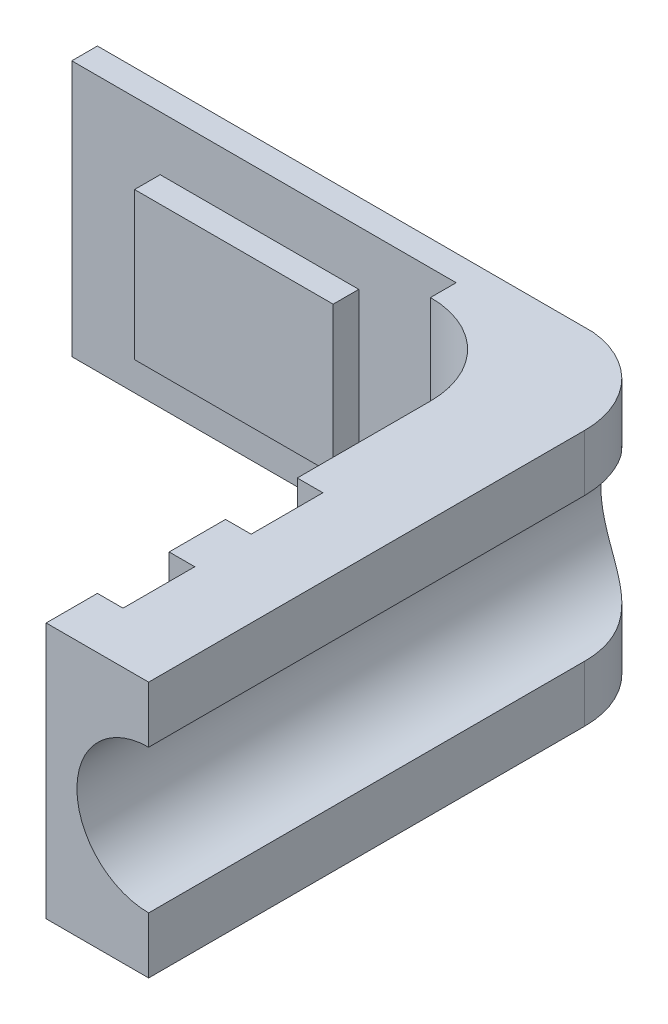
ISO-10303-21;
HEADER;
FILE_DESCRIPTION(('STEP AP214'),'2;1');
FILE_NAME('part.step','',(''),(''),'','','');
FILE_SCHEMA(('AUTOMOTIVE_DESIGN { 1 0 10303 214 1 1 1 1 }'));
ENDSEC;
DATA;
#1=APPLICATION_CONTEXT('core data for automotive mechanical design processes');
#2=APPLICATION_PROTOCOL_DEFINITION('international standard','automotive_design',2000,#1);
#3=PRODUCT_CONTEXT('',#1,'mechanical');
#4=PRODUCT('Part','Part','',(#3));
#5=PRODUCT_RELATED_PRODUCT_CATEGORY('part','',(#4));
#6=PRODUCT_DEFINITION_FORMATION('','',#4);
#7=PRODUCT_DEFINITION_CONTEXT('part definition',#1,'design');
#8=PRODUCT_DEFINITION('design','',#6,#7);
#9=PRODUCT_DEFINITION_SHAPE('','',#8);
#10=(LENGTH_UNIT() NAMED_UNIT(*) SI_UNIT(.MILLI.,.METRE.));
#11=(NAMED_UNIT(*) PLANE_ANGLE_UNIT() SI_UNIT($,.RADIAN.));
#12=(NAMED_UNIT(*) SI_UNIT($,.STERADIAN.) SOLID_ANGLE_UNIT());
#13=UNCERTAINTY_MEASURE_WITH_UNIT(LENGTH_MEASURE(1.E-05),#10,'distance_accuracy_value','');
#14=(GEOMETRIC_REPRESENTATION_CONTEXT(3) GLOBAL_UNCERTAINTY_ASSIGNED_CONTEXT((#13)) GLOBAL_UNIT_ASSIGNED_CONTEXT((#10,
#11,#12)) REPRESENTATION_CONTEXT('',''));
#15=CARTESIAN_POINT('',(0.,0.,0.));
#16=DIRECTION('',(0.,0.,1.));
#17=DIRECTION('',(1.,0.,0.));
#18=AXIS2_PLACEMENT_3D('',#15,#16,#17);
#19=CARTESIAN_POINT('',(3.5,10.,0.));
#20=DIRECTION('',(1.,0.,0.));
#21=DIRECTION('',(0.,0.,-1.));
#22=AXIS2_PLACEMENT_3D('',#19,#20,#21);
#23=PLANE('',#22);
#24=DIRECTION('',(0.,-1.,0.));
#25=VECTOR('',#24,1.);
#26=CARTESIAN_POINT('',(3.5,1.,5.2));
#27=LINE('',#26,#25);
#28=CARTESIAN_POINT('',(3.5,1.,5.2));
#29=VERTEX_POINT('',#28);
#30=CARTESIAN_POINT('',(3.5,0.,5.2));
#31=VERTEX_POINT('',#30);
#32=EDGE_CURVE('E239',#29,#31,#27,.T.);
#33=ORIENTED_EDGE('',*,*,#32,.F.);
#34=DIRECTION('',(0.,0.,1.));
#35=VECTOR('',#34,1.);
#36=CARTESIAN_POINT('',(3.5,1.,5.2));
#37=LINE('',#36,#35);
#38=CARTESIAN_POINT('',(3.5,1.,8.));
#39=VERTEX_POINT('',#38);
#40=EDGE_CURVE('E225',#29,#39,#37,.T.);
#41=ORIENTED_EDGE('',*,*,#40,.T.);
#42=DIRECTION('',(0.,-1.,0.));
#43=VECTOR('',#42,1.);
#44=CARTESIAN_POINT('',(3.5,1.,8.));
#45=LINE('',#44,#43);
#46=CARTESIAN_POINT('',(3.5,0.,8.));
#47=VERTEX_POINT('',#46);
#48=EDGE_CURVE('E256',#39,#47,#45,.T.);
#49=ORIENTED_EDGE('',*,*,#48,.T.);
#50=DIRECTION('',(0.,0.,1.));
#51=VECTOR('',#50,1.);
#52=CARTESIAN_POINT('',(3.5,0.,0.));
#53=LINE('',#52,#51);
#54=CARTESIAN_POINT('',(3.5,0.,10.2));
#55=VERTEX_POINT('',#54);
#56=EDGE_CURVE('E460',#47,#55,#53,.T.);
#57=ORIENTED_EDGE('',*,*,#56,.T.);
#58=DIRECTION('',(0.,-1.,0.));
#59=VECTOR('',#58,1.);
#60=CARTESIAN_POINT('',(3.5,1.,10.2));
#61=LINE('',#60,#59);
#62=CARTESIAN_POINT('',(3.5,1.,10.2));
#63=VERTEX_POINT('',#62);
#64=EDGE_CURVE('E295',#63,#55,#61,.T.);
#65=ORIENTED_EDGE('',*,*,#64,.F.);
#66=DIRECTION('',(0.,0.,1.));
#67=VECTOR('',#66,1.);
#68=CARTESIAN_POINT('',(3.5,1.,10.2));
#69=LINE('',#68,#67);
#70=CARTESIAN_POINT('',(3.5,1.,13.));
#71=VERTEX_POINT('',#70);
#72=EDGE_CURVE('E304',#63,#71,#69,.T.);
#73=ORIENTED_EDGE('',*,*,#72,.T.);
#74=DIRECTION('',(0.,-1.,0.));
#75=VECTOR('',#74,1.);
#76=CARTESIAN_POINT('',(3.5,1.,13.));
#77=LINE('',#76,#75);
#78=CARTESIAN_POINT('',(3.5,0.,13.));
#79=VERTEX_POINT('',#78);
#80=EDGE_CURVE('E309',#71,#79,#77,.T.);
#81=ORIENTED_EDGE('',*,*,#80,.T.);
#82=CARTESIAN_POINT('',(3.5,0.,15.));
#83=VERTEX_POINT('',#82);
#84=EDGE_CURVE('E456',#79,#83,#53,.T.);
#85=ORIENTED_EDGE('',*,*,#84,.T.);
#86=DIRECTION('',(0.,-1.,0.));
#87=VECTOR('',#86,1.);
#88=CARTESIAN_POINT('',(3.5,10.,15.));
#89=LINE('',#88,#87);
#90=CARTESIAN_POINT('',(3.5,10.,15.));
#91=VERTEX_POINT('',#90);
#92=EDGE_CURVE('E483',#91,#83,#89,.T.);
#93=ORIENTED_EDGE('',*,*,#92,.F.);
#94=DIRECTION('',(0.,0.,1.));
#95=VECTOR('',#94,1.);
#96=CARTESIAN_POINT('',(3.5,10.,0.));
#97=LINE('',#96,#95);
#98=CARTESIAN_POINT('',(3.5,10.,13.));
#99=VERTEX_POINT('',#98);
#100=EDGE_CURVE('E425',#99,#91,#97,.T.);
#101=ORIENTED_EDGE('',*,*,#100,.F.);
#102=DIRECTION('',(0.,-1.,0.));
#103=VECTOR('',#102,1.);
#104=CARTESIAN_POINT('',(3.5,9.,13.));
#105=LINE('',#104,#103);
#106=CARTESIAN_POINT('',(3.5,9.,13.));
#107=VERTEX_POINT('',#106);
#108=EDGE_CURVE('E341',#99,#107,#105,.T.);
#109=ORIENTED_EDGE('',*,*,#108,.T.);
#110=DIRECTION('',(0.,0.,1.));
#111=VECTOR('',#110,1.);
#112=CARTESIAN_POINT('',(3.5,9.,10.2));
#113=LINE('',#112,#111);
#114=CARTESIAN_POINT('',(3.5,9.,10.2));
#115=VERTEX_POINT('',#114);
#116=EDGE_CURVE('E337',#115,#107,#113,.T.);
#117=ORIENTED_EDGE('',*,*,#116,.F.);
#118=DIRECTION('',(0.,-1.,0.));
#119=VECTOR('',#118,1.);
#120=CARTESIAN_POINT('',(3.5,9.,10.2));
#121=LINE('',#120,#119);
#122=CARTESIAN_POINT('',(3.5,10.,10.2));
#123=VERTEX_POINT('',#122);
#124=EDGE_CURVE('E329',#123,#115,#121,.T.);
#125=ORIENTED_EDGE('',*,*,#124,.F.);
#126=CARTESIAN_POINT('',(3.5,10.,8.));
#127=VERTEX_POINT('',#126);
#128=EDGE_CURVE('E431',#127,#123,#97,.T.);
#129=ORIENTED_EDGE('',*,*,#128,.F.);
#130=DIRECTION('',(0.,-1.,0.));
#131=VECTOR('',#130,1.);
#132=CARTESIAN_POINT('',(3.5,9.,8.));
#133=LINE('',#132,#131);
#134=CARTESIAN_POINT('',(3.5,9.,8.));
#135=VERTEX_POINT('',#134);
#136=EDGE_CURVE('E61',#127,#135,#133,.T.);
#137=ORIENTED_EDGE('',*,*,#136,.T.);
#138=DIRECTION('',(0.,0.,1.));
#139=VECTOR('',#138,1.);
#140=CARTESIAN_POINT('',(3.5,9.,5.2));
#141=LINE('',#140,#139);
#142=CARTESIAN_POINT('',(3.5,9.,5.2));
#143=VERTEX_POINT('',#142);
#144=EDGE_CURVE('E277',#143,#135,#141,.T.);
#145=ORIENTED_EDGE('',*,*,#144,.F.);
#146=DIRECTION('',(0.,-1.,0.));
#147=VECTOR('',#146,1.);
#148=CARTESIAN_POINT('',(3.5,9.,5.2));
#149=LINE('',#148,#147);
#150=CARTESIAN_POINT('',(3.5,10.,5.2));
#151=VERTEX_POINT('',#150);
#152=EDGE_CURVE('E269',#151,#143,#149,.T.);
#153=ORIENTED_EDGE('',*,*,#152,.F.);
#154=CARTESIAN_POINT('',(3.5,10.,0.));
#155=VERTEX_POINT('',#154);
#156=EDGE_CURVE('E426',#155,#151,#97,.T.);
#157=ORIENTED_EDGE('',*,*,#156,.F.);
#158=DIRECTION('',(0.,-1.,0.));
#159=VECTOR('',#158,1.);
#160=CARTESIAN_POINT('',(3.5,10.,0.));
#161=LINE('',#160,#159);
#162=CARTESIAN_POINT('',(3.5,0.,0.));
#163=VERTEX_POINT('',#162);
#164=EDGE_CURVE('E487',#155,#163,#161,.T.);
#165=ORIENTED_EDGE('',*,*,#164,.T.);
#166=EDGE_CURVE('E248',#163,#31,#53,.T.);
#167=ORIENTED_EDGE('',*,*,#166,.T.);
#168=EDGE_LOOP('',(#33,#41,#49,#57,#65,#73,#81,#85,#93,#101,#109,#117,#125,#129,#137,#145,#153,
#157,#165,#167));
#169=FACE_BOUND('',#168,.T.);
#170=ADVANCED_FACE('F39',(#169),#23,.F.);
#171=CARTESIAN_POINT('',(4.,10.,-2.01719528206896));
#172=DIRECTION('',(0.,1.,0.));
#173=DIRECTION('',(0.,0.,1.));
#174=AXIS2_PLACEMENT_3D('',#171,#172,#173);
#175=PLANE('',#174);
#176=ORIENTED_EDGE('',*,*,#156,.T.);
#177=DIRECTION('',(-1.,0.,0.));
#178=VECTOR('',#177,1.);
#179=CARTESIAN_POINT('',(3.5,10.,5.2));
#180=LINE('',#179,#178);
#181=CARTESIAN_POINT('',(4.5,10.,5.2));
#182=VERTEX_POINT('',#181);
#183=EDGE_CURVE('E266',#182,#151,#180,.T.);
#184=ORIENTED_EDGE('',*,*,#183,.F.);
#185=DIRECTION('',(0.,0.,1.));
#186=VECTOR('',#185,1.);
#187=CARTESIAN_POINT('',(4.5,10.,5.2));
#188=LINE('',#187,#186);
#189=CARTESIAN_POINT('',(4.5,10.,8.));
#190=VERTEX_POINT('',#189);
#191=EDGE_CURVE('E257',#182,#190,#188,.T.);
#192=ORIENTED_EDGE('',*,*,#191,.T.);
#193=DIRECTION('',(-1.,0.,0.));
#194=VECTOR('',#193,1.);
#195=CARTESIAN_POINT('',(3.5,10.,8.));
#196=LINE('',#195,#194);
#197=EDGE_CURVE('E278',#190,#127,#196,.T.);
#198=ORIENTED_EDGE('',*,*,#197,.T.);
#199=ORIENTED_EDGE('',*,*,#128,.T.);
#200=DIRECTION('',(-1.,0.,0.));
#201=VECTOR('',#200,1.);
#202=CARTESIAN_POINT('',(3.5,10.,10.2));
#203=LINE('',#202,#201);
#204=CARTESIAN_POINT('',(4.5,10.,10.2));
#205=VERTEX_POINT('',#204);
#206=EDGE_CURVE('E325',#205,#123,#203,.T.);
#207=ORIENTED_EDGE('',*,*,#206,.F.);
#208=DIRECTION('',(0.,0.,1.));
#209=VECTOR('',#208,1.);
#210=CARTESIAN_POINT('',(4.5,10.,10.2));
#211=LINE('',#210,#209);
#212=CARTESIAN_POINT('',(4.5,10.,13.));
#213=VERTEX_POINT('',#212);
#214=EDGE_CURVE('E310',#205,#213,#211,.T.);
#215=ORIENTED_EDGE('',*,*,#214,.T.);
#216=DIRECTION('',(-1.,0.,0.));
#217=VECTOR('',#216,1.);
#218=CARTESIAN_POINT('',(3.5,10.,13.));
#219=LINE('',#218,#217);
#220=EDGE_CURVE('E264',#213,#99,#219,.T.);
#221=ORIENTED_EDGE('',*,*,#220,.T.);
#222=ORIENTED_EDGE('',*,*,#100,.T.);
#223=DIRECTION('',(1.,0.,0.));
#224=VECTOR('',#223,1.);
#225=CARTESIAN_POINT('',(3.5,10.,15.));
#226=LINE('',#225,#224);
#227=CARTESIAN_POINT('',(7.5,10.,15.));
#228=VERTEX_POINT('',#227);
#229=EDGE_CURVE('E430',#91,#228,#226,.T.);
#230=ORIENTED_EDGE('',*,*,#229,.T.);
#231=DIRECTION('',(0.,0.,-1.));
#232=VECTOR('',#231,1.);
#233=CARTESIAN_POINT('',(7.5,10.,-2.01719528206896));
#234=LINE('',#233,#232);
#235=CARTESIAN_POINT('',(7.5,10.,-2.01719528206896));
#236=VERTEX_POINT('',#235);
#237=EDGE_CURVE('E434',#228,#236,#234,.T.);
#238=ORIENTED_EDGE('',*,*,#237,.T.);
#239=CARTESIAN_POINT('',(4.,10.,-2.01719528206896));
#240=DIRECTION('',(0.,1.,0.));
#241=DIRECTION('',(0.,0.,1.));
#242=AXIS2_PLACEMENT_3D('',#239,#240,#241);
#243=CIRCLE('',#242,3.5);
#244=CARTESIAN_POINT('',(4.34651305423787,10.,-5.5));
#245=VERTEX_POINT('',#244);
#246=EDGE_CURVE('E437',#236,#245,#243,.T.);
#247=ORIENTED_EDGE('',*,*,#246,.T.);
#248=DIRECTION('',(-1.,0.,0.));
#249=VECTOR('',#248,1.);
#250=CARTESIAN_POINT('',(-15.,10.,-5.5));
#251=LINE('',#250,#249);
#252=CARTESIAN_POINT('',(-15.,10.,-5.5));
#253=VERTEX_POINT('',#252);
#254=EDGE_CURVE('E408',#245,#253,#251,.T.);
#255=ORIENTED_EDGE('',*,*,#254,.T.);
#256=DIRECTION('',(0.,0.,1.));
#257=VECTOR('',#256,1.);
#258=CARTESIAN_POINT('',(-15.,10.,-4.5));
#259=LINE('',#258,#257);
#260=CARTESIAN_POINT('',(-15.,10.,-4.5));
#261=VERTEX_POINT('',#260);
#262=EDGE_CURVE('E412',#253,#261,#259,.T.);
#263=ORIENTED_EDGE('',*,*,#262,.T.);
#264=DIRECTION('',(1.,0.,0.));
#265=VECTOR('',#264,1.);
#266=CARTESIAN_POINT('',(-15.,10.,-4.5));
#267=LINE('',#266,#265);
#268=CARTESIAN_POINT('',(0.,10.,-4.5));
#269=VERTEX_POINT('',#268);
#270=EDGE_CURVE('E416',#261,#269,#267,.T.);
#271=ORIENTED_EDGE('',*,*,#270,.T.);
#272=DIRECTION('',(0.,0.,1.));
#273=VECTOR('',#272,1.);
#274=CARTESIAN_POINT('',(0.,10.,-4.5));
#275=LINE('',#274,#273);
#276=CARTESIAN_POINT('',(0.,10.,-3.5));
#277=VERTEX_POINT('',#276);
#278=EDGE_CURVE('E419',#269,#277,#275,.T.);
#279=ORIENTED_EDGE('',*,*,#278,.T.);
#280=CARTESIAN_POINT('',(0.,10.,0.));
#281=DIRECTION('',(0.,-1.,0.));
#282=DIRECTION('',(0.,0.,-1.));
#283=AXIS2_PLACEMENT_3D('',#280,#281,#282);
#284=CIRCLE('',#283,3.5);
#285=EDGE_CURVE('E422',#277,#155,#284,.T.);
#286=ORIENTED_EDGE('',*,*,#285,.T.);
#287=EDGE_LOOP('',(#176,#184,#192,#198,#199,#207,#215,#221,#222,#230,#238,#247,#255,#263,#271,
#279,#286));
#288=FACE_BOUND('',#287,.T.);
#289=ADVANCED_FACE('F529',(#288),#175,.T.);
#290=CARTESIAN_POINT('',(4.,0.,-2.01719528206896));
#291=DIRECTION('',(0.,1.,0.));
#292=DIRECTION('',(0.,0.,1.));
#293=AXIS2_PLACEMENT_3D('',#290,#291,#292);
#294=PLANE('',#293);
#295=DIRECTION('',(1.,0.,0.));
#296=VECTOR('',#295,1.);
#297=CARTESIAN_POINT('',(3.5,0.,5.2));
#298=LINE('',#297,#296);
#299=CARTESIAN_POINT('',(4.5,0.,5.2));
#300=VERTEX_POINT('',#299);
#301=EDGE_CURVE('E235',#31,#300,#298,.T.);
#302=ORIENTED_EDGE('',*,*,#301,.F.);
#303=ORIENTED_EDGE('',*,*,#166,.F.);
#304=CARTESIAN_POINT('',(0.,0.,0.));
#305=DIRECTION('',(0.,-1.,0.));
#306=DIRECTION('',(0.,0.,-1.));
#307=AXIS2_PLACEMENT_3D('',#304,#305,#306);
#308=CIRCLE('',#307,3.5);
#309=CARTESIAN_POINT('',(0.,0.,-3.5));
#310=VERTEX_POINT('',#309);
#311=EDGE_CURVE('E453',#310,#163,#308,.T.);
#312=ORIENTED_EDGE('',*,*,#311,.F.);
#313=DIRECTION('',(0.,0.,1.));
#314=VECTOR('',#313,1.);
#315=CARTESIAN_POINT('',(0.,0.,-4.5));
#316=LINE('',#315,#314);
#317=CARTESIAN_POINT('',(0.,0.,-4.5));
#318=VERTEX_POINT('',#317);
#319=EDGE_CURVE('E450',#318,#310,#316,.T.);
#320=ORIENTED_EDGE('',*,*,#319,.F.);
#321=DIRECTION('',(1.,0.,0.));
#322=VECTOR('',#321,1.);
#323=CARTESIAN_POINT('',(-15.,0.,-4.5));
#324=LINE('',#323,#322);
#325=CARTESIAN_POINT('',(-15.,0.,-4.5));
#326=VERTEX_POINT('',#325);
#327=EDGE_CURVE('E447',#326,#318,#324,.T.);
#328=ORIENTED_EDGE('',*,*,#327,.F.);
#329=DIRECTION('',(0.,0.,1.));
#330=VECTOR('',#329,1.);
#331=CARTESIAN_POINT('',(-15.,0.,-4.5));
#332=LINE('',#331,#330);
#333=CARTESIAN_POINT('',(-15.,0.,-5.5));
#334=VERTEX_POINT('',#333);
#335=EDGE_CURVE('E444',#334,#326,#332,.T.);
#336=ORIENTED_EDGE('',*,*,#335,.F.);
#337=DIRECTION('',(-1.,0.,0.));
#338=VECTOR('',#337,1.);
#339=CARTESIAN_POINT('',(-15.,0.,-5.5));
#340=LINE('',#339,#338);
#341=CARTESIAN_POINT('',(4.34651305423787,0.,-5.5));
#342=VERTEX_POINT('',#341);
#343=EDGE_CURVE('E407',#342,#334,#340,.T.);
#344=ORIENTED_EDGE('',*,*,#343,.F.);
#345=CARTESIAN_POINT('',(4.,0.,-2.01719528206896));
#346=DIRECTION('',(0.,1.,0.));
#347=DIRECTION('',(0.,0.,1.));
#348=AXIS2_PLACEMENT_3D('',#345,#346,#347);
#349=CIRCLE('',#348,3.5);
#350=CARTESIAN_POINT('',(7.5,0.,-2.01719528206896));
#351=VERTEX_POINT('',#350);
#352=EDGE_CURVE('E413',#351,#342,#349,.T.);
#353=ORIENTED_EDGE('',*,*,#352,.F.);
#354=DIRECTION('',(0.,0.,-1.));
#355=VECTOR('',#354,1.);
#356=CARTESIAN_POINT('',(7.5,0.,-2.01719528206896));
#357=LINE('',#356,#355);
#358=CARTESIAN_POINT('',(7.5,0.,15.));
#359=VERTEX_POINT('',#358);
#360=EDGE_CURVE('E464',#359,#351,#357,.T.);
#361=ORIENTED_EDGE('',*,*,#360,.F.);
#362=DIRECTION('',(1.,0.,0.));
#363=VECTOR('',#362,1.);
#364=CARTESIAN_POINT('',(3.5,0.,15.));
#365=LINE('',#364,#363);
#366=EDGE_CURVE('E459',#83,#359,#365,.T.);
#367=ORIENTED_EDGE('',*,*,#366,.F.);
#368=ORIENTED_EDGE('',*,*,#84,.F.);
#369=DIRECTION('',(1.,0.,0.));
#370=VECTOR('',#369,1.);
#371=CARTESIAN_POINT('',(3.5,0.,13.));
#372=LINE('',#371,#370);
#373=CARTESIAN_POINT('',(4.5,0.,13.));
#374=VERTEX_POINT('',#373);
#375=EDGE_CURVE('E296',#79,#374,#372,.T.);
#376=ORIENTED_EDGE('',*,*,#375,.T.);
#377=DIRECTION('',(0.,0.,1.));
#378=VECTOR('',#377,1.);
#379=CARTESIAN_POINT('',(4.5,0.,10.2));
#380=LINE('',#379,#378);
#381=CARTESIAN_POINT('',(4.5,0.,10.2));
#382=VERTEX_POINT('',#381);
#383=EDGE_CURVE('E317',#382,#374,#380,.T.);
#384=ORIENTED_EDGE('',*,*,#383,.F.);
#385=DIRECTION('',(1.,0.,0.));
#386=VECTOR('',#385,1.);
#387=CARTESIAN_POINT('',(3.5,0.,10.2));
#388=LINE('',#387,#386);
#389=EDGE_CURVE('E300',#55,#382,#388,.T.);
#390=ORIENTED_EDGE('',*,*,#389,.F.);
#391=ORIENTED_EDGE('',*,*,#56,.F.);
#392=DIRECTION('',(1.,0.,0.));
#393=VECTOR('',#392,1.);
#394=CARTESIAN_POINT('',(3.5,0.,8.));
#395=LINE('',#394,#393);
#396=CARTESIAN_POINT('',(4.5,0.,8.));
#397=VERTEX_POINT('',#396);
#398=EDGE_CURVE('E243',#47,#397,#395,.T.);
#399=ORIENTED_EDGE('',*,*,#398,.T.);
#400=DIRECTION('',(0.,0.,1.));
#401=VECTOR('',#400,1.);
#402=CARTESIAN_POINT('',(4.5,0.,5.2));
#403=LINE('',#402,#401);
#404=EDGE_CURVE('E234',#300,#397,#403,.T.);
#405=ORIENTED_EDGE('',*,*,#404,.F.);
#406=EDGE_LOOP('',(#302,#303,#312,#320,#328,#336,#344,#353,#361,#367,#368,#376,#384,#390,#391,
#399,#405));
#407=FACE_BOUND('',#406,.T.);
#408=ADVANCED_FACE('F513',(#407),#294,.F.);
#409=CARTESIAN_POINT('',(7.5,10.,-2.01719528206896));
#410=DIRECTION('',(-1.,0.,0.));
#411=DIRECTION('',(0.,0.,1.));
#412=AXIS2_PLACEMENT_3D('',#409,#410,#411);
#413=PLANE('',#412);
#414=DIRECTION('',(0.,-1.,0.));
#415=VECTOR('',#414,1.);
#416=CARTESIAN_POINT('',(7.5,10.,-2.01719528206896));
#417=LINE('',#416,#415);
#418=CARTESIAN_POINT('',(7.5,2.2,-2.01719528206896));
#419=VERTEX_POINT('',#418);
#420=EDGE_CURVE('E473',#419,#351,#417,.T.);
#421=ORIENTED_EDGE('',*,*,#420,.F.);
#422=DIRECTION('',(0.,0.,1.));
#423=VECTOR('',#422,1.);
#424=CARTESIAN_POINT('',(7.5,2.2,-5.5));
#425=LINE('',#424,#423);
#426=CARTESIAN_POINT('',(7.5,2.2,15.));
#427=VERTEX_POINT('',#426);
#428=EDGE_CURVE('E355',#419,#427,#425,.T.);
#429=ORIENTED_EDGE('',*,*,#428,.T.);
#430=DIRECTION('',(0.,-1.,0.));
#431=VECTOR('',#430,1.);
#432=CARTESIAN_POINT('',(7.5,10.,15.));
#433=LINE('',#432,#431);
#434=EDGE_CURVE('E478',#427,#359,#433,.T.);
#435=ORIENTED_EDGE('',*,*,#434,.T.);
#436=ORIENTED_EDGE('',*,*,#360,.T.);
#437=EDGE_LOOP('',(#421,#429,#435,#436));
#438=FACE_BOUND('',#437,.T.);
#439=ADVANCED_FACE('F539',(#438),#413,.F.);
#440=CARTESIAN_POINT('',(-15.,10.,-4.5));
#441=DIRECTION('',(0.,0.,-1.));
#442=DIRECTION('',(-1.,0.,0.));
#443=AXIS2_PLACEMENT_3D('',#440,#441,#442);
#444=PLANE('',#443);
#445=ORIENTED_EDGE('',*,*,#327,.T.);
#446=DIRECTION('',(0.,-1.,0.));
#447=VECTOR('',#446,1.);
#448=CARTESIAN_POINT('',(0.,10.,-4.5));
#449=LINE('',#448,#447);
#450=EDGE_CURVE('E494',#269,#318,#449,.T.);
#451=ORIENTED_EDGE('',*,*,#450,.F.);
#452=ORIENTED_EDGE('',*,*,#270,.F.);
#453=DIRECTION('',(0.,-1.,0.));
#454=VECTOR('',#453,1.);
#455=CARTESIAN_POINT('',(-15.,10.,-4.5));
#456=LINE('',#455,#454);
#457=EDGE_CURVE('E498',#261,#326,#456,.T.);
#458=ORIENTED_EDGE('',*,*,#457,.T.);
#459=EDGE_LOOP('',(#445,#451,#452,#458));
#460=FACE_BOUND('',#459,.T.);
#461=DIRECTION('',(0.,1.,0.));
#462=VECTOR('',#461,1.);
#463=CARTESIAN_POINT('',(-3.8,7.875,-4.5));
#464=LINE('',#463,#462);
#465=CARTESIAN_POINT('',(-3.8,2.12500000000001,-4.5));
#466=VERTEX_POINT('',#465);
#467=CARTESIAN_POINT('',(-3.8,7.87500000000001,-4.5));
#468=VERTEX_POINT('',#467);
#469=EDGE_CURVE('E359',#466,#468,#464,.T.);
#470=ORIENTED_EDGE('',*,*,#469,.F.);
#471=DIRECTION('',(1.,0.,0.));
#472=VECTOR('',#471,1.);
#473=CARTESIAN_POINT('',(-11.55,2.12500000000001,-4.5));
#474=LINE('',#473,#472);
#475=CARTESIAN_POINT('',(-11.55,2.12500000000001,-4.5));
#476=VERTEX_POINT('',#475);
#477=EDGE_CURVE('E368',#476,#466,#474,.T.);
#478=ORIENTED_EDGE('',*,*,#477,.F.);
#479=DIRECTION('',(0.,-1.,0.));
#480=VECTOR('',#479,1.);
#481=CARTESIAN_POINT('',(-11.55,7.87500000000001,-4.5));
#482=LINE('',#481,#480);
#483=CARTESIAN_POINT('',(-11.55,7.87500000000001,-4.5));
#484=VERTEX_POINT('',#483);
#485=EDGE_CURVE('E385',#484,#476,#482,.T.);
#486=ORIENTED_EDGE('',*,*,#485,.F.);
#487=DIRECTION('',(-1.,0.,0.));
#488=VECTOR('',#487,1.);
#489=CARTESIAN_POINT('',(-11.55,7.87500000000001,-4.5));
#490=LINE('',#489,#488);
#491=EDGE_CURVE('E381',#468,#484,#490,.T.);
#492=ORIENTED_EDGE('',*,*,#491,.F.);
#493=EDGE_LOOP('',(#470,#478,#486,#492));
#494=FACE_BOUND('',#493,.T.);
#495=ADVANCED_FACE('F520',(#460,#494),#444,.F.);
#496=CARTESIAN_POINT('',(-15.,10.,-5.5));
#497=DIRECTION('',(0.,0.,1.));
#498=DIRECTION('',(1.,0.,0.));
#499=AXIS2_PLACEMENT_3D('',#496,#497,#498);
#500=PLANE('',#499);
#501=ORIENTED_EDGE('',*,*,#343,.T.);
#502=DIRECTION('',(0.,-1.,0.));
#503=VECTOR('',#502,1.);
#504=CARTESIAN_POINT('',(-15.,10.,-5.5));
#505=LINE('',#504,#503);
#506=EDGE_CURVE('E54',#253,#334,#505,.T.);
#507=ORIENTED_EDGE('',*,*,#506,.F.);
#508=ORIENTED_EDGE('',*,*,#254,.F.);
#509=DIRECTION('',(0.,-1.,0.));
#510=VECTOR('',#509,1.);
#511=CARTESIAN_POINT('',(4.34651305423787,10.,-5.5));
#512=LINE('',#511,#510);
#513=EDGE_CURVE('E440',#245,#342,#512,.T.);
#514=ORIENTED_EDGE('',*,*,#513,.T.);
#515=EDGE_LOOP('',(#501,#507,#508,#514));
#516=FACE_BOUND('',#515,.T.);
#517=ADVANCED_FACE('F41',(#516),#500,.F.);
#518=CARTESIAN_POINT('',(-15.,10.,-4.5));
#519=DIRECTION('',(1.,0.,0.));
#520=DIRECTION('',(0.,0.,-1.));
#521=AXIS2_PLACEMENT_3D('',#518,#519,#520);
#522=PLANE('',#521);
#523=ORIENTED_EDGE('',*,*,#335,.T.);
#524=ORIENTED_EDGE('',*,*,#457,.F.);
#525=ORIENTED_EDGE('',*,*,#262,.F.);
#526=ORIENTED_EDGE('',*,*,#506,.T.);
#527=EDGE_LOOP('',(#523,#524,#525,#526));
#528=FACE_BOUND('',#527,.T.);
#529=ADVANCED_FACE('F505',(#528),#522,.F.);
#530=CARTESIAN_POINT('',(0.,10.,-4.5));
#531=DIRECTION('',(1.,0.,0.));
#532=DIRECTION('',(0.,0.,-1.));
#533=AXIS2_PLACEMENT_3D('',#530,#531,#532);
#534=PLANE('',#533);
#535=ORIENTED_EDGE('',*,*,#319,.T.);
#536=DIRECTION('',(0.,-1.,0.));
#537=VECTOR('',#536,1.);
#538=CARTESIAN_POINT('',(0.,10.,-3.5));
#539=LINE('',#538,#537);
#540=EDGE_CURVE('E490',#277,#310,#539,.T.);
#541=ORIENTED_EDGE('',*,*,#540,.F.);
#542=ORIENTED_EDGE('',*,*,#278,.F.);
#543=ORIENTED_EDGE('',*,*,#450,.T.);
#544=EDGE_LOOP('',(#535,#541,#542,#543));
#545=FACE_BOUND('',#544,.T.);
#546=ADVANCED_FACE('F525',(#545),#534,.F.);
#547=CARTESIAN_POINT('',(0.,10.,0.));
#548=DIRECTION('',(0.,-1.,0.));
#549=DIRECTION('',(0.,0.,-1.));
#550=AXIS2_PLACEMENT_3D('',#547,#548,#549);
#551=CYLINDRICAL_SURFACE('',#550,3.5);
#552=ORIENTED_EDGE('',*,*,#311,.T.);
#553=ORIENTED_EDGE('',*,*,#164,.F.);
#554=ORIENTED_EDGE('',*,*,#285,.F.);
#555=ORIENTED_EDGE('',*,*,#540,.T.);
#556=EDGE_LOOP('',(#552,#553,#554,#555));
#557=FACE_BOUND('',#556,.T.);
#558=ADVANCED_FACE('F583',(#557),#551,.F.);
#559=CARTESIAN_POINT('',(3.5,10.,15.));
#560=DIRECTION('',(0.,0.,-1.));
#561=DIRECTION('',(-1.,0.,0.));
#562=AXIS2_PLACEMENT_3D('',#559,#560,#561);
#563=PLANE('',#562);
#564=ORIENTED_EDGE('',*,*,#434,.F.);
#565=CARTESIAN_POINT('',(7.5,5.,15.));
#566=DIRECTION('',(0.,0.,1.));
#567=DIRECTION('',(1.,0.,0.));
#568=AXIS2_PLACEMENT_3D('',#565,#566,#567);
#569=CIRCLE('',#568,2.8);
#570=CARTESIAN_POINT('',(7.5,7.8,15.));
#571=VERTEX_POINT('',#570);
#572=EDGE_CURVE('E321',#571,#427,#569,.T.);
#573=ORIENTED_EDGE('',*,*,#572,.F.);
#574=EDGE_CURVE('E479',#228,#571,#433,.T.);
#575=ORIENTED_EDGE('',*,*,#574,.F.);
#576=ORIENTED_EDGE('',*,*,#229,.F.);
#577=ORIENTED_EDGE('',*,*,#92,.T.);
#578=ORIENTED_EDGE('',*,*,#366,.T.);
#579=EDGE_LOOP('',(#564,#573,#575,#576,#577,#578));
#580=FACE_BOUND('',#579,.T.);
#581=ADVANCED_FACE('F544',(#580),#563,.F.);
#582=ORIENTED_EDGE('',*,*,#574,.T.);
#583=DIRECTION('',(0.,0.,1.));
#584=VECTOR('',#583,1.);
#585=CARTESIAN_POINT('',(7.5,7.8,-5.5));
#586=LINE('',#585,#584);
#587=CARTESIAN_POINT('',(7.5,7.8,-2.01719528206896));
#588=VERTEX_POINT('',#587);
#589=EDGE_CURVE('E356',#588,#571,#586,.T.);
#590=ORIENTED_EDGE('',*,*,#589,.F.);
#591=EDGE_CURVE('E474',#236,#588,#417,.T.);
#592=ORIENTED_EDGE('',*,*,#591,.F.);
#593=ORIENTED_EDGE('',*,*,#237,.F.);
#594=EDGE_LOOP('',(#582,#590,#592,#593));
#595=FACE_BOUND('',#594,.T.);
#596=ADVANCED_FACE('F608',(#595),#413,.F.);
#597=CARTESIAN_POINT('',(4.,10.,-2.01719528206896));
#598=DIRECTION('',(0.,-1.,0.));
#599=DIRECTION('',(0.,0.,-1.));
#600=AXIS2_PLACEMENT_3D('',#597,#598,#599);
#601=CYLINDRICAL_SURFACE('',#600,3.5);
#602=ORIENTED_EDGE('',*,*,#591,.T.);
#603=CARTESIAN_POINT('',(7.5,7.8,-2.01719528206896));
#604=CARTESIAN_POINT('',(7.50001021676816,7.79996218441873,-2.11480497604137));
#605=CARTESIAN_POINT('',(7.49591713868846,7.7999988133738,-2.21241320863707));
#606=CARTESIAN_POINT('',(7.4795976167923,7.79994765948239,-2.40695076926059));
#607=CARTESIAN_POINT('',(7.46737090291583,7.79985987250483,-2.50388007463808));
#608=CARTESIAN_POINT('',(7.43479167103447,7.79928539408302,-2.69676603554726));
#609=CARTESIAN_POINT('',(7.41440652728685,7.7987970926437,-2.79271718017671));
#610=CARTESIAN_POINT('',(7.36566065545166,7.79688245129346,-2.98256080067346));
#611=CARTESIAN_POINT('',(7.3373001724846,7.79545614021029,-3.07645333971602));
#612=CARTESIAN_POINT('',(7.27275251461261,7.79095067373492,-3.26167408185437));
#613=CARTESIAN_POINT('',(7.2365504587538,7.7878683590503,-3.35299703111772));
#614=CARTESIAN_POINT('',(7.15665154140355,7.77915923119807,-3.53217731745716));
#615=CARTESIAN_POINT('',(7.11295533054667,7.7735326388526,-3.6200349545742));
#616=CARTESIAN_POINT('',(7.01859871275631,7.75871840724365,-3.79134318307697));
#617=CARTESIAN_POINT('',(6.96795552249882,7.74953947237767,-3.87480398456599));
#618=CARTESIAN_POINT('',(6.86021463300209,7.72648233376497,-4.0367547014251));
#619=CARTESIAN_POINT('',(6.80311920286306,7.71260577865527,-4.11524634927151));
#620=CARTESIAN_POINT('',(6.69835085363455,7.68319377801083,-4.24747060262951));
#621=CARTESIAN_POINT('',(6.65191031294592,7.66894911197021,-4.30247240183627));
#622=CARTESIAN_POINT('',(6.5563355169426,7.6366721519278,-4.40890173905396));
#623=CARTESIAN_POINT('',(6.5072018805912,7.61864072557481,-4.46033009225137));
#624=CARTESIAN_POINT('',(6.40681414085268,7.57834598234195,-4.55928328952592));
#625=CARTESIAN_POINT('',(6.35556079080581,7.55608415899192,-4.60680950278781));
#626=CARTESIAN_POINT('',(6.25161369425292,7.50695702770809,-4.69768004202373));
#627=CARTESIAN_POINT('',(6.19892065068855,7.4800939337768,-4.74102636363883));
#628=CARTESIAN_POINT('',(6.09253355102553,7.4213119631748,-4.82359213292625));
#629=CARTESIAN_POINT('',(6.03883547452618,7.38936482272001,-4.8627863387992));
#630=CARTESIAN_POINT('',(5.93161334159882,7.32039309322649,-4.93663121572048));
#631=CARTESIAN_POINT('',(5.87808922250316,7.28337060491439,-4.97128375505298));
#632=CARTESIAN_POINT('',(5.77206394922717,7.20422632741619,-5.03607774687604));
#633=CARTESIAN_POINT('',(5.71956305220581,7.16210327504915,-5.06621807774487));
#634=CARTESIAN_POINT('',(5.61646734934694,7.07290874168197,-5.12210628201149));
#635=CARTESIAN_POINT('',(5.5658724427661,7.02583752272283,-5.14785438781997));
#636=CARTESIAN_POINT('',(5.47168068068105,6.93131445860967,-5.19314329004251));
#637=CARTESIAN_POINT('',(5.4278580030616,6.88425227318981,-5.21302928796481));
#638=CARTESIAN_POINT('',(5.34300562594601,6.78649772671781,-5.24960479605709));
#639=CARTESIAN_POINT('',(5.30197687999546,6.73580413829044,-5.2662932184107));
#640=CARTESIAN_POINT('',(5.18384147110508,6.57876866806782,-5.3119870676567));
#641=CARTESIAN_POINT('',(5.11160920850754,6.46739608017629,-5.336656088858));
#642=CARTESIAN_POINT('',(4.9809313167141,6.23017075545816,-5.37765080329857));
#643=CARTESIAN_POINT('',(4.92307054530043,6.10394280854571,-5.39364687092457));
#644=CARTESIAN_POINT('',(4.82652365117396,5.84368110339236,-5.41856931489625));
#645=CARTESIAN_POINT('',(4.78784324519413,5.70964503121546,-5.42749358395655));
#646=CARTESIAN_POINT('',(4.72873541389777,5.42710192743935,-5.44063657798987));
#647=CARTESIAN_POINT('',(4.70984840141651,5.2782531824297,-5.44446378393821));
#648=CARTESIAN_POINT('',(4.6960810097126,4.97937882140205,-5.44728505409649));
#649=CARTESIAN_POINT('',(4.70120669731411,4.82935291753317,-5.44627789689988));
#650=CARTESIAN_POINT('',(4.73580962796354,4.52781570254283,-5.43902389428205));
#651=CARTESIAN_POINT('',(4.76599368347777,4.37638897113898,-5.43262488341617));
#652=CARTESIAN_POINT('',(4.85070347969179,4.08086978035957,-5.41251382478702));
#653=CARTESIAN_POINT('',(4.90523097678736,3.93677785103077,-5.39880124933122));
#654=CARTESIAN_POINT('',(5.00310791628404,3.73064872136487,-5.3705344473611));
#655=CARTESIAN_POINT('',(5.03814477687087,3.66399567362584,-5.35991957639854));
#656=CARTESIAN_POINT('',(5.11319230721691,3.53413567492586,-5.335683245866));
#657=CARTESIAN_POINT('',(5.15320073896235,3.47092719165409,-5.32206313701432));
#658=CARTESIAN_POINT('',(5.23767954173242,3.34850439826154,-5.29136166373385));
#659=CARTESIAN_POINT('',(5.28214772300651,3.28928815159381,-5.27428199380001));
#660=CARTESIAN_POINT('',(5.37494182587368,3.1753011489274,-5.23620887303749));
#661=CARTESIAN_POINT('',(5.42326743404903,3.12053003248759,-5.21521573999479));
#662=CARTESIAN_POINT('',(5.51972393057567,3.01932700741017,-5.17045936110622));
#663=CARTESIAN_POINT('',(5.56765559075888,2.97258301588489,-5.14697179708374));
#664=CARTESIAN_POINT('',(5.66555527493559,2.88359029634054,-5.09598925464664));
#665=CARTESIAN_POINT('',(5.71552396677392,2.84134305925226,-5.06849295422333));
#666=CARTESIAN_POINT('',(5.81669184848671,2.76155870984943,-5.00936114026367));
#667=CARTESIAN_POINT('',(5.8678901528031,2.72401832213294,-4.97772853676559));
#668=CARTESIAN_POINT('',(5.97077034857085,2.65365189937837,-4.9102665207899));
#669=CARTESIAN_POINT('',(6.02245241119499,2.62082760586056,-4.87443556680216));
#670=CARTESIAN_POINT('',(6.17141947693655,2.53268406841048,-4.76482881857921));
#671=CARTESIAN_POINT('',(6.26836790431884,2.48333346619693,-4.68565592539667));
#672=CARTESIAN_POINT('',(6.45636903757071,2.39971646039958,-4.51369938834661));
#673=CARTESIAN_POINT('',(6.54741970195157,2.36545525640726,-4.42091106745721));
#674=CARTESIAN_POINT('',(6.72667243715948,2.30713532445296,-4.21609291307576));
#675=CARTESIAN_POINT('',(6.814127567238,2.28405406507923,-4.10313528149393));
#676=CARTESIAN_POINT('',(6.97517725095558,2.24838549097062,-3.86622031382052));
#677=CARTESIAN_POINT('',(7.04876121989182,2.23580616507876,-3.74225468308128));
#678=CARTESIAN_POINT('',(7.19204748958777,2.21588072883736,-3.46277810770662));
#679=CARTESIAN_POINT('',(7.25868285952851,2.20987905721706,-3.30559867388839));
#680=CARTESIAN_POINT('',(7.36837352182405,2.2025532201891,-2.98314849849178));
#681=CARTESIAN_POINT('',(7.41143134454305,2.20122855275785,-2.8178786272614));
#682=CARTESIAN_POINT('',(7.46146154237721,2.20020105245284,-2.54595557421404));
#683=CARTESIAN_POINT('',(7.47591443925545,2.20007573047451,-2.44062304105213));
#684=CARTESIAN_POINT('',(7.49517853367701,2.19999885848505,-2.22926950523615));
#685=CARTESIAN_POINT('',(7.50000688940206,2.20004699880235,-2.12325006642496));
#686=CARTESIAN_POINT('',(7.5,2.2,-2.01719528206896));
#687=B_SPLINE_CURVE_WITH_KNOTS('',3,(#603,#604,#605,#606,#607,#608,#609,#610,#611,#612,#613,
#614,#615,#616,#617,#618,#619,#620,#621,#622,#623,#624,#625,#626,#627,#628,#629,#630,#631,#632,
#633,#634,#635,#636,#637,#638,#639,#640,#641,#642,#643,#644,#645,#646,#647,#648,#649,#650,#651,
#652,#653,#654,#655,#656,#657,#658,#659,#660,#661,#662,#663,#664,#665,#666,#667,#668,#669,#670,
#671,#672,#673,#674,#675,#676,#677,#678,#679,#680,#681,#682,#683,#684,#685,#686),.UNSPECIFIED.,
.F.,.F.,(4,2,2,2,2,2,2,2,2,2,2,2,2,2,2,2,2,2,2,2,2,2,2,2,2,2,2,2,2,2,2,2,2,2,2,2,2,2,2,2,2,4),
(0.,0.292741196718134,0.585492113767937,0.879425637064608,1.17335012735779,1.46783736282607,
1.76229904415608,2.05604372056938,2.3496854135264,2.56961755528248,2.78949935953324,
3.00930367886824,3.22900253011464,3.44996840803891,3.67084310103711,3.89177260709931,
4.11269041924393,4.31438159892982,4.5161412726708,4.91932475029326,5.33691497975498,
5.75462959783094,6.20286914184229,6.65122193996999,7.1126688284891,7.57414901609529,
7.80203975368362,8.02982827259658,8.25750548919064,8.48516422569761,8.6977396820073,
8.91038540109664,9.12288231318327,9.33545749379844,9.73715963719175,10.1390000933225,
10.5714895578336,11.0043077189938,11.5148064184985,12.0252503200668,12.3438036181353,
12.6617885045582),.UNSPECIFIED.);
#688=EDGE_CURVE('E11',#588,#419,#687,.T.);
#689=ORIENTED_EDGE('',*,*,#688,.T.);
#690=ORIENTED_EDGE('',*,*,#420,.T.);
#691=ORIENTED_EDGE('',*,*,#352,.T.);
#692=ORIENTED_EDGE('',*,*,#513,.F.);
#693=ORIENTED_EDGE('',*,*,#246,.F.);
#694=EDGE_LOOP('',(#602,#689,#690,#691,#692,#693));
#695=FACE_BOUND('',#694,.T.);
#696=ADVANCED_FACE('F535',(#695),#601,.T.);
#697=CARTESIAN_POINT('',(-3.8,7.875,-3.5));
#698=DIRECTION('',(-1.,0.,0.));
#699=DIRECTION('',(0.,-1.,0.));
#700=AXIS2_PLACEMENT_3D('',#697,#698,#699);
#701=PLANE('',#700);
#702=ORIENTED_EDGE('',*,*,#469,.T.);
#703=DIRECTION('',(0.,0.,-1.));
#704=VECTOR('',#703,1.);
#705=CARTESIAN_POINT('',(-3.8,7.875,-3.5));
#706=LINE('',#705,#704);
#707=CARTESIAN_POINT('',(-3.8,7.875,-3.5));
#708=VERTEX_POINT('',#707);
#709=EDGE_CURVE('E403',#708,#468,#706,.T.);
#710=ORIENTED_EDGE('',*,*,#709,.F.);
#711=DIRECTION('',(0.,1.,0.));
#712=VECTOR('',#711,1.);
#713=CARTESIAN_POINT('',(-3.8,7.875,-3.5));
#714=LINE('',#713,#712);
#715=CARTESIAN_POINT('',(-3.8,2.12500000000001,-3.5));
#716=VERTEX_POINT('',#715);
#717=EDGE_CURVE('E363',#716,#708,#714,.T.);
#718=ORIENTED_EDGE('',*,*,#717,.F.);
#719=DIRECTION('',(0.,0.,-1.));
#720=VECTOR('',#719,1.);
#721=CARTESIAN_POINT('',(-3.8,2.12500000000001,-3.5));
#722=LINE('',#721,#720);
#723=EDGE_CURVE('E377',#716,#466,#722,.T.);
#724=ORIENTED_EDGE('',*,*,#723,.T.);
#725=EDGE_LOOP('',(#702,#710,#718,#724));
#726=FACE_BOUND('',#725,.T.);
#727=ADVANCED_FACE('F689',(#726),#701,.F.);
#728=CARTESIAN_POINT('',(-11.55,7.87500000000001,-3.5));
#729=DIRECTION('',(0.,-1.,0.));
#730=DIRECTION('',(1.,0.,0.));
#731=AXIS2_PLACEMENT_3D('',#728,#729,#730);
#732=PLANE('',#731);
#733=ORIENTED_EDGE('',*,*,#491,.T.);
#734=DIRECTION('',(0.,0.,-1.));
#735=VECTOR('',#734,1.);
#736=CARTESIAN_POINT('',(-11.55,7.87500000000001,-3.5));
#737=LINE('',#736,#735);
#738=CARTESIAN_POINT('',(-11.55,7.87500000000001,-3.5));
#739=VERTEX_POINT('',#738);
#740=EDGE_CURVE('E399',#739,#484,#737,.T.);
#741=ORIENTED_EDGE('',*,*,#740,.F.);
#742=DIRECTION('',(-1.,0.,0.));
#743=VECTOR('',#742,1.);
#744=CARTESIAN_POINT('',(-11.55,7.87500000000001,-3.5));
#745=LINE('',#744,#743);
#746=EDGE_CURVE('E367',#708,#739,#745,.T.);
#747=ORIENTED_EDGE('',*,*,#746,.F.);
#748=ORIENTED_EDGE('',*,*,#709,.T.);
#749=EDGE_LOOP('',(#733,#741,#747,#748));
#750=FACE_BOUND('',#749,.T.);
#751=ADVANCED_FACE('F727',(#750),#732,.F.);
#752=CARTESIAN_POINT('',(-11.55,7.87500000000001,-3.5));
#753=DIRECTION('',(1.,0.,0.));
#754=DIRECTION('',(0.,1.,0.));
#755=AXIS2_PLACEMENT_3D('',#752,#753,#754);
#756=PLANE('',#755);
#757=ORIENTED_EDGE('',*,*,#485,.T.);
#758=DIRECTION('',(0.,0.,-1.));
#759=VECTOR('',#758,1.);
#760=CARTESIAN_POINT('',(-11.55,2.12500000000001,-3.5));
#761=LINE('',#760,#759);
#762=CARTESIAN_POINT('',(-11.55,2.12500000000001,-3.5));
#763=VERTEX_POINT('',#762);
#764=EDGE_CURVE('E395',#763,#476,#761,.T.);
#765=ORIENTED_EDGE('',*,*,#764,.F.);
#766=DIRECTION('',(0.,-1.,0.));
#767=VECTOR('',#766,1.);
#768=CARTESIAN_POINT('',(-11.55,7.87500000000001,-3.5));
#769=LINE('',#768,#767);
#770=EDGE_CURVE('E371',#739,#763,#769,.T.);
#771=ORIENTED_EDGE('',*,*,#770,.F.);
#772=ORIENTED_EDGE('',*,*,#740,.T.);
#773=EDGE_LOOP('',(#757,#765,#771,#772));
#774=FACE_BOUND('',#773,.T.);
#775=ADVANCED_FACE('F731',(#774),#756,.F.);
#776=CARTESIAN_POINT('',(-11.55,2.12500000000001,-3.5));
#777=DIRECTION('',(0.,1.,0.));
#778=DIRECTION('',(-1.,0.,0.));
#779=AXIS2_PLACEMENT_3D('',#776,#777,#778);
#780=PLANE('',#779);
#781=ORIENTED_EDGE('',*,*,#477,.T.);
#782=ORIENTED_EDGE('',*,*,#723,.F.);
#783=DIRECTION('',(1.,0.,0.));
#784=VECTOR('',#783,1.);
#785=CARTESIAN_POINT('',(-11.55,2.12500000000001,-3.5));
#786=LINE('',#785,#784);
#787=EDGE_CURVE('E374',#763,#716,#786,.T.);
#788=ORIENTED_EDGE('',*,*,#787,.F.);
#789=ORIENTED_EDGE('',*,*,#764,.T.);
#790=EDGE_LOOP('',(#781,#782,#788,#789));
#791=FACE_BOUND('',#790,.T.);
#792=ADVANCED_FACE('F735',(#791),#780,.F.);
#793=CARTESIAN_POINT('',(0.,0.,-3.5));
#794=DIRECTION('',(0.,0.,1.));
#795=DIRECTION('',(1.,0.,0.));
#796=AXIS2_PLACEMENT_3D('',#793,#794,#795);
#797=PLANE('',#796);
#798=ORIENTED_EDGE('',*,*,#717,.T.);
#799=ORIENTED_EDGE('',*,*,#746,.T.);
#800=ORIENTED_EDGE('',*,*,#770,.T.);
#801=ORIENTED_EDGE('',*,*,#787,.T.);
#802=EDGE_LOOP('',(#798,#799,#800,#801));
#803=FACE_BOUND('',#802,.T.);
#804=ADVANCED_FACE('F679',(#803),#797,.T.);
#805=CARTESIAN_POINT('',(7.5,5.,-5.5));
#806=DIRECTION('',(0.,0.,1.));
#807=DIRECTION('',(1.,0.,0.));
#808=AXIS2_PLACEMENT_3D('',#805,#806,#807);
#809=CYLINDRICAL_SURFACE('',#808,2.8);
#810=ORIENTED_EDGE('',*,*,#589,.T.);
#811=ORIENTED_EDGE('',*,*,#572,.T.);
#812=ORIENTED_EDGE('',*,*,#428,.F.);
#813=ORIENTED_EDGE('',*,*,#688,.F.);
#814=EDGE_LOOP('',(#810,#811,#812,#813));
#815=FACE_BOUND('',#814,.T.);
#816=ADVANCED_FACE('F671',(#815),#809,.F.);
#817=CARTESIAN_POINT('',(4.5,0.,10.2));
#818=DIRECTION('',(0.707106781186547,0.707106781186548,0.));
#819=DIRECTION('',(-0.707106781186548,0.707106781186547,0.));
#820=AXIS2_PLACEMENT_3D('',#817,#818,#819);
#821=PLANE('',#820);
#822=DIRECTION('',(-0.707106781186548,0.707106781186547,0.));
#823=VECTOR('',#822,1.);
#824=CARTESIAN_POINT('',(4.5,0.,13.));
#825=LINE('',#824,#823);
#826=EDGE_CURVE('E305',#374,#71,#825,.T.);
#827=ORIENTED_EDGE('',*,*,#826,.T.);
#828=ORIENTED_EDGE('',*,*,#72,.F.);
#829=DIRECTION('',(-0.707106781186548,0.707106781186547,0.));
#830=VECTOR('',#829,1.);
#831=CARTESIAN_POINT('',(4.5,0.,10.2));
#832=LINE('',#831,#830);
#833=EDGE_CURVE('E291',#382,#63,#832,.T.);
#834=ORIENTED_EDGE('',*,*,#833,.F.);
#835=ORIENTED_EDGE('',*,*,#383,.T.);
#836=EDGE_LOOP('',(#827,#828,#834,#835));
#837=FACE_BOUND('',#836,.T.);
#838=ADVANCED_FACE('F559',(#837),#821,.F.);
#839=CARTESIAN_POINT('',(0.,0.,10.2));
#840=DIRECTION('',(0.,0.,1.));
#841=DIRECTION('',(1.,0.,0.));
#842=AXIS2_PLACEMENT_3D('',#839,#840,#841);
#843=PLANE('',#842);
#844=ORIENTED_EDGE('',*,*,#833,.T.);
#845=ORIENTED_EDGE('',*,*,#64,.T.);
#846=ORIENTED_EDGE('',*,*,#389,.T.);
#847=EDGE_LOOP('',(#844,#845,#846));
#848=FACE_BOUND('',#847,.T.);
#849=ADVANCED_FACE('F556',(#848),#843,.T.);
#850=CARTESIAN_POINT('',(0.,0.,13.));
#851=DIRECTION('',(0.,0.,1.));
#852=DIRECTION('',(1.,0.,0.));
#853=AXIS2_PLACEMENT_3D('',#850,#851,#852);
#854=PLANE('',#853);
#855=ORIENTED_EDGE('',*,*,#826,.F.);
#856=ORIENTED_EDGE('',*,*,#375,.F.);
#857=ORIENTED_EDGE('',*,*,#80,.F.);
#858=EDGE_LOOP('',(#855,#856,#857));
#859=FACE_BOUND('',#858,.T.);
#860=ADVANCED_FACE('F561',(#859),#854,.F.);
#861=CARTESIAN_POINT('',(4.5,10.,10.2));
#862=DIRECTION('',(0.707106781186547,-0.707106781186548,0.));
#863=DIRECTION('',(0.707106781186548,0.707106781186547,0.));
#864=AXIS2_PLACEMENT_3D('',#861,#862,#863);
#865=PLANE('',#864);
#866=DIRECTION('',(0.707106781186548,0.707106781186547,0.));
#867=VECTOR('',#866,1.);
#868=CARTESIAN_POINT('',(4.5,10.,13.));
#869=LINE('',#868,#867);
#870=EDGE_CURVE('E330',#107,#213,#869,.T.);
#871=ORIENTED_EDGE('',*,*,#870,.T.);
#872=ORIENTED_EDGE('',*,*,#214,.F.);
#873=DIRECTION('',(0.707106781186548,0.707106781186547,0.));
#874=VECTOR('',#873,1.);
#875=CARTESIAN_POINT('',(4.5,10.,10.2));
#876=LINE('',#875,#874);
#877=EDGE_CURVE('E333',#115,#205,#876,.T.);
#878=ORIENTED_EDGE('',*,*,#877,.F.);
#879=ORIENTED_EDGE('',*,*,#116,.T.);
#880=EDGE_LOOP('',(#871,#872,#878,#879));
#881=FACE_BOUND('',#880,.T.);
#882=ADVANCED_FACE('F563',(#881),#865,.F.);
#883=CARTESIAN_POINT('',(0.,0.,10.2));
#884=DIRECTION('',(0.,0.,1.));
#885=DIRECTION('',(1.,0.,0.));
#886=AXIS2_PLACEMENT_3D('',#883,#884,#885);
#887=PLANE('',#886);
#888=ORIENTED_EDGE('',*,*,#206,.T.);
#889=ORIENTED_EDGE('',*,*,#124,.T.);
#890=ORIENTED_EDGE('',*,*,#877,.T.);
#891=EDGE_LOOP('',(#888,#889,#890));
#892=FACE_BOUND('',#891,.T.);
#893=ADVANCED_FACE('F569',(#892),#887,.T.);
#894=CARTESIAN_POINT('',(0.,0.,13.));
#895=DIRECTION('',(0.,0.,1.));
#896=DIRECTION('',(1.,0.,0.));
#897=AXIS2_PLACEMENT_3D('',#894,#895,#896);
#898=PLANE('',#897);
#899=ORIENTED_EDGE('',*,*,#220,.F.);
#900=ORIENTED_EDGE('',*,*,#870,.F.);
#901=ORIENTED_EDGE('',*,*,#108,.F.);
#902=EDGE_LOOP('',(#899,#900,#901));
#903=FACE_BOUND('',#902,.T.);
#904=ADVANCED_FACE('F631',(#903),#898,.F.);
#905=CARTESIAN_POINT('',(4.5,0.,5.2));
#906=DIRECTION('',(0.707106781186547,0.707106781186548,0.));
#907=DIRECTION('',(-0.707106781186548,0.707106781186547,0.));
#908=AXIS2_PLACEMENT_3D('',#905,#906,#907);
#909=PLANE('',#908);
#910=DIRECTION('',(-0.707106781186548,0.707106781186547,0.));
#911=VECTOR('',#910,1.);
#912=CARTESIAN_POINT('',(4.5,0.,8.));
#913=LINE('',#912,#911);
#914=EDGE_CURVE('E69',#397,#39,#913,.T.);
#915=ORIENTED_EDGE('',*,*,#914,.T.);
#916=ORIENTED_EDGE('',*,*,#40,.F.);
#917=DIRECTION('',(-0.707106781186548,0.707106781186547,0.));
#918=VECTOR('',#917,1.);
#919=CARTESIAN_POINT('',(4.5,0.,5.2));
#920=LINE('',#919,#918);
#921=EDGE_CURVE('E228',#300,#29,#920,.T.);
#922=ORIENTED_EDGE('',*,*,#921,.F.);
#923=ORIENTED_EDGE('',*,*,#404,.T.);
#924=EDGE_LOOP('',(#915,#916,#922,#923));
#925=FACE_BOUND('',#924,.T.);
#926=ADVANCED_FACE('F227',(#925),#909,.F.);
#927=CARTESIAN_POINT('',(0.,0.,5.2));
#928=DIRECTION('',(0.,0.,1.));
#929=DIRECTION('',(1.,0.,0.));
#930=AXIS2_PLACEMENT_3D('',#927,#928,#929);
#931=PLANE('',#930);
#932=ORIENTED_EDGE('',*,*,#921,.T.);
#933=ORIENTED_EDGE('',*,*,#32,.T.);
#934=ORIENTED_EDGE('',*,*,#301,.T.);
#935=EDGE_LOOP('',(#932,#933,#934));
#936=FACE_BOUND('',#935,.T.);
#937=ADVANCED_FACE('F238',(#936),#931,.T.);
#938=CARTESIAN_POINT('',(0.,0.,8.));
#939=DIRECTION('',(0.,0.,1.));
#940=DIRECTION('',(1.,0.,0.));
#941=AXIS2_PLACEMENT_3D('',#938,#939,#940);
#942=PLANE('',#941);
#943=ORIENTED_EDGE('',*,*,#914,.F.);
#944=ORIENTED_EDGE('',*,*,#398,.F.);
#945=ORIENTED_EDGE('',*,*,#48,.F.);
#946=EDGE_LOOP('',(#943,#944,#945));
#947=FACE_BOUND('',#946,.T.);
#948=ADVANCED_FACE('F807',(#947),#942,.F.);
#949=CARTESIAN_POINT('',(4.5,10.,5.2));
#950=DIRECTION('',(0.707106781186547,-0.707106781186548,0.));
#951=DIRECTION('',(0.707106781186548,0.707106781186547,0.));
#952=AXIS2_PLACEMENT_3D('',#949,#950,#951);
#953=PLANE('',#952);
#954=DIRECTION('',(0.707106781186548,0.707106781186547,0.));
#955=VECTOR('',#954,1.);
#956=CARTESIAN_POINT('',(4.5,10.,8.));
#957=LINE('',#956,#955);
#958=EDGE_CURVE('E270',#135,#190,#957,.T.);
#959=ORIENTED_EDGE('',*,*,#958,.T.);
#960=ORIENTED_EDGE('',*,*,#191,.F.);
#961=DIRECTION('',(0.707106781186548,0.707106781186547,0.));
#962=VECTOR('',#961,1.);
#963=CARTESIAN_POINT('',(4.5,10.,5.2));
#964=LINE('',#963,#962);
#965=EDGE_CURVE('E273',#143,#182,#964,.T.);
#966=ORIENTED_EDGE('',*,*,#965,.F.);
#967=ORIENTED_EDGE('',*,*,#144,.T.);
#968=EDGE_LOOP('',(#959,#960,#966,#967));
#969=FACE_BOUND('',#968,.T.);
#970=ADVANCED_FACE('F793',(#969),#953,.F.);
#971=CARTESIAN_POINT('',(0.,0.,5.2));
#972=DIRECTION('',(0.,0.,1.));
#973=DIRECTION('',(1.,0.,0.));
#974=AXIS2_PLACEMENT_3D('',#971,#972,#973);
#975=PLANE('',#974);
#976=ORIENTED_EDGE('',*,*,#183,.T.);
#977=ORIENTED_EDGE('',*,*,#152,.T.);
#978=ORIENTED_EDGE('',*,*,#965,.T.);
#979=EDGE_LOOP('',(#976,#977,#978));
#980=FACE_BOUND('',#979,.T.);
#981=ADVANCED_FACE('F799',(#980),#975,.T.);
#982=CARTESIAN_POINT('',(0.,0.,8.));
#983=DIRECTION('',(0.,0.,1.));
#984=DIRECTION('',(1.,0.,0.));
#985=AXIS2_PLACEMENT_3D('',#982,#983,#984);
#986=PLANE('',#985);
#987=ORIENTED_EDGE('',*,*,#197,.F.);
#988=ORIENTED_EDGE('',*,*,#958,.F.);
#989=ORIENTED_EDGE('',*,*,#136,.F.);
#990=EDGE_LOOP('',(#987,#988,#989));
#991=FACE_BOUND('',#990,.T.);
#992=ADVANCED_FACE('F791',(#991),#986,.F.);
#993=CLOSED_SHELL('',(#170,#289,#408,#439,#495,#517,#529,#546,#558,#581,#596,#696,#727,#751,
#775,#792,#804,#816,#838,#849,#860,#882,#893,#904,#926,#937,#948,#970,#981,#992));
#994=MANIFOLD_SOLID_BREP('B2',#993);
#995=ADVANCED_BREP_SHAPE_REPRESENTATION('',(#18,#994),#14);
#996=SHAPE_DEFINITION_REPRESENTATION(#9,#995);
ENDSEC;
END-ISO-10303-21;
